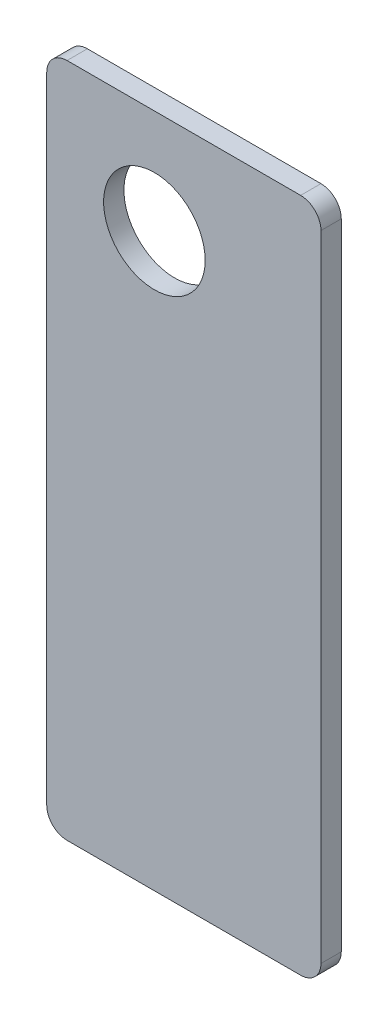
ISO-10303-21;
HEADER;
FILE_DESCRIPTION(('STEP AP214'),'2;1');
FILE_NAME('part.step','',(''),(''),'','','');
FILE_SCHEMA(('AUTOMOTIVE_DESIGN { 1 0 10303 214 1 1 1 1 }'));
ENDSEC;
DATA;
#1=APPLICATION_CONTEXT('core data for automotive mechanical design processes');
#2=APPLICATION_PROTOCOL_DEFINITION('international standard','automotive_design',2000,#1);
#3=PRODUCT_CONTEXT('',#1,'mechanical');
#4=PRODUCT('Part','Part','',(#3));
#5=PRODUCT_RELATED_PRODUCT_CATEGORY('part','',(#4));
#6=PRODUCT_DEFINITION_FORMATION('','',#4);
#7=PRODUCT_DEFINITION_CONTEXT('part definition',#1,'design');
#8=PRODUCT_DEFINITION('design','',#6,#7);
#9=PRODUCT_DEFINITION_SHAPE('','',#8);
#10=(LENGTH_UNIT() NAMED_UNIT(*) SI_UNIT(.MILLI.,.METRE.));
#11=(NAMED_UNIT(*) PLANE_ANGLE_UNIT() SI_UNIT($,.RADIAN.));
#12=(NAMED_UNIT(*) SI_UNIT($,.STERADIAN.) SOLID_ANGLE_UNIT());
#13=UNCERTAINTY_MEASURE_WITH_UNIT(LENGTH_MEASURE(1.E-05),#10,'distance_accuracy_value','');
#14=(GEOMETRIC_REPRESENTATION_CONTEXT(3) GLOBAL_UNCERTAINTY_ASSIGNED_CONTEXT((#13)) GLOBAL_UNIT_ASSIGNED_CONTEXT((#10,
#11,#12)) REPRESENTATION_CONTEXT('',''));
#15=CARTESIAN_POINT('',(0.,0.,0.));
#16=DIRECTION('',(0.,0.,1.));
#17=DIRECTION('',(1.,0.,0.));
#18=AXIS2_PLACEMENT_3D('',#15,#16,#17);
#19=CARTESIAN_POINT('',(11.5,38.5,10.));
#20=DIRECTION('',(0.,0.,1.));
#21=DIRECTION('',(1.,0.,0.));
#22=AXIS2_PLACEMENT_3D('',#19,#20,#21);
#23=PLANE('',#22);
#24=CARTESIAN_POINT('',(11.5,38.5,10.));
#25=DIRECTION('',(0.,0.,1.));
#26=DIRECTION('',(1.,0.,0.));
#27=AXIS2_PLACEMENT_3D('',#24,#25,#26);
#28=CIRCLE('',#27,2.);
#29=CARTESIAN_POINT('',(13.5,38.5,10.));
#30=VERTEX_POINT('',#29);
#31=CARTESIAN_POINT('',(11.5,40.5,10.));
#32=VERTEX_POINT('',#31);
#33=EDGE_CURVE('E167',#30,#32,#28,.T.);
#34=ORIENTED_EDGE('',*,*,#33,.T.);
#35=DIRECTION('',(-1.,0.,0.));
#36=VECTOR('',#35,1.);
#37=CARTESIAN_POINT('',(11.5,40.5,10.));
#38=LINE('',#37,#36);
#39=CARTESIAN_POINT('',(-11.5,40.5,10.));
#40=VERTEX_POINT('',#39);
#41=EDGE_CURVE('E103',#32,#40,#38,.T.);
#42=ORIENTED_EDGE('',*,*,#41,.T.);
#43=CARTESIAN_POINT('',(-11.5,38.5,10.));
#44=DIRECTION('',(0.,0.,1.));
#45=DIRECTION('',(1.,0.,0.));
#46=AXIS2_PLACEMENT_3D('',#43,#44,#45);
#47=CIRCLE('',#46,2.);
#48=CARTESIAN_POINT('',(-13.5,38.5,10.));
#49=VERTEX_POINT('',#48);
#50=EDGE_CURVE('E188',#40,#49,#47,.T.);
#51=ORIENTED_EDGE('',*,*,#50,.T.);
#52=DIRECTION('',(0.,-1.,0.));
#53=VECTOR('',#52,1.);
#54=CARTESIAN_POINT('',(-13.5,38.5,10.));
#55=LINE('',#54,#53);
#56=CARTESIAN_POINT('',(-13.5,-24.,10.));
#57=VERTEX_POINT('',#56);
#58=EDGE_CURVE('E202',#49,#57,#55,.T.);
#59=ORIENTED_EDGE('',*,*,#58,.T.);
#60=CARTESIAN_POINT('',(-11.5,-24.,10.));
#61=DIRECTION('',(0.,0.,1.));
#62=DIRECTION('',(1.,0.,0.));
#63=AXIS2_PLACEMENT_3D('',#60,#61,#62);
#64=CIRCLE('',#63,1.99999999999999);
#65=CARTESIAN_POINT('',(-11.5,-26.,10.));
#66=VERTEX_POINT('',#65);
#67=EDGE_CURVE('E122',#57,#66,#64,.T.);
#68=ORIENTED_EDGE('',*,*,#67,.T.);
#69=DIRECTION('',(1.,0.,0.));
#70=VECTOR('',#69,1.);
#71=CARTESIAN_POINT('',(-11.5,-26.,10.));
#72=LINE('',#71,#70);
#73=CARTESIAN_POINT('',(11.5,-26.,10.));
#74=VERTEX_POINT('',#73);
#75=EDGE_CURVE('E116',#66,#74,#72,.T.);
#76=ORIENTED_EDGE('',*,*,#75,.T.);
#77=CARTESIAN_POINT('',(11.5,-24.,10.));
#78=DIRECTION('',(0.,0.,1.));
#79=DIRECTION('',(1.,0.,0.));
#80=AXIS2_PLACEMENT_3D('',#77,#78,#79);
#81=CIRCLE('',#80,2.);
#82=CARTESIAN_POINT('',(13.5,-24.,10.));
#83=VERTEX_POINT('',#82);
#84=EDGE_CURVE('E120',#74,#83,#81,.T.);
#85=ORIENTED_EDGE('',*,*,#84,.T.);
#86=DIRECTION('',(0.,1.,0.));
#87=VECTOR('',#86,1.);
#88=CARTESIAN_POINT('',(13.5,-24.,10.));
#89=LINE('',#88,#87);
#90=EDGE_CURVE('E60',#83,#30,#89,.T.);
#91=ORIENTED_EDGE('',*,*,#90,.T.);
#92=EDGE_LOOP('',(#34,#42,#51,#59,#68,#76,#85,#91));
#93=FACE_BOUND('',#92,.T.);
#94=CARTESIAN_POINT('',(-2.9,30.25,10.));
#95=DIRECTION('',(0.,0.,1.));
#96=DIRECTION('',(1.,0.,0.));
#97=AXIS2_PLACEMENT_3D('',#94,#95,#96);
#98=CIRCLE('',#97,5.);
#99=CARTESIAN_POINT('',(2.1,30.25,10.));
#100=VERTEX_POINT('',#99);
#101=EDGE_CURVE('E148',#100,#100,#98,.T.);
#102=ORIENTED_EDGE('',*,*,#101,.F.);
#103=EDGE_LOOP('',(#102));
#104=FACE_BOUND('',#103,.T.);
#105=ADVANCED_FACE('F42',(#93,#104),#23,.T.);
#106=CARTESIAN_POINT('',(11.5,38.5,8.));
#107=DIRECTION('',(0.,0.,1.));
#108=DIRECTION('',(1.,0.,0.));
#109=AXIS2_PLACEMENT_3D('',#106,#107,#108);
#110=PLANE('',#109);
#111=CARTESIAN_POINT('',(11.5,38.5,8.));
#112=DIRECTION('',(0.,0.,1.));
#113=DIRECTION('',(1.,0.,0.));
#114=AXIS2_PLACEMENT_3D('',#111,#112,#113);
#115=CIRCLE('',#114,2.);
#116=CARTESIAN_POINT('',(13.5,38.5,8.));
#117=VERTEX_POINT('',#116);
#118=CARTESIAN_POINT('',(11.5,40.5,8.));
#119=VERTEX_POINT('',#118);
#120=EDGE_CURVE('E143',#117,#119,#115,.T.);
#121=ORIENTED_EDGE('',*,*,#120,.F.);
#122=DIRECTION('',(0.,1.,0.));
#123=VECTOR('',#122,1.);
#124=CARTESIAN_POINT('',(13.5,-24.,8.));
#125=LINE('',#124,#123);
#126=CARTESIAN_POINT('',(13.5,-24.,8.));
#127=VERTEX_POINT('',#126);
#128=EDGE_CURVE('E95',#127,#117,#125,.T.);
#129=ORIENTED_EDGE('',*,*,#128,.F.);
#130=CARTESIAN_POINT('',(11.5,-24.,8.));
#131=DIRECTION('',(0.,0.,1.));
#132=DIRECTION('',(1.,0.,0.));
#133=AXIS2_PLACEMENT_3D('',#130,#131,#132);
#134=CIRCLE('',#133,2.);
#135=CARTESIAN_POINT('',(11.5,-26.,8.));
#136=VERTEX_POINT('',#135);
#137=EDGE_CURVE('E89',#136,#127,#134,.T.);
#138=ORIENTED_EDGE('',*,*,#137,.F.);
#139=DIRECTION('',(1.,0.,0.));
#140=VECTOR('',#139,1.);
#141=CARTESIAN_POINT('',(5.25,-26.,8.));
#142=LINE('',#141,#140);
#143=CARTESIAN_POINT('',(-11.5,-26.,8.));
#144=VERTEX_POINT('',#143);
#145=EDGE_CURVE('E130',#144,#136,#142,.T.);
#146=ORIENTED_EDGE('',*,*,#145,.F.);
#147=CARTESIAN_POINT('',(-11.5,-24.,8.));
#148=DIRECTION('',(0.,0.,1.));
#149=DIRECTION('',(1.,0.,0.));
#150=AXIS2_PLACEMENT_3D('',#147,#148,#149);
#151=CIRCLE('',#150,1.99999999999999);
#152=CARTESIAN_POINT('',(-13.5,-24.,8.));
#153=VERTEX_POINT('',#152);
#154=EDGE_CURVE('E157',#153,#144,#151,.T.);
#155=ORIENTED_EDGE('',*,*,#154,.F.);
#156=DIRECTION('',(0.,-1.,0.));
#157=VECTOR('',#156,1.);
#158=CARTESIAN_POINT('',(-13.5,38.5,8.));
#159=LINE('',#158,#157);
#160=CARTESIAN_POINT('',(-13.5,38.5,8.));
#161=VERTEX_POINT('',#160);
#162=EDGE_CURVE('E154',#161,#153,#159,.T.);
#163=ORIENTED_EDGE('',*,*,#162,.F.);
#164=CARTESIAN_POINT('',(-11.5,38.5,8.));
#165=DIRECTION('',(0.,0.,1.));
#166=DIRECTION('',(1.,0.,0.));
#167=AXIS2_PLACEMENT_3D('',#164,#165,#166);
#168=CIRCLE('',#167,2.);
#169=CARTESIAN_POINT('',(-11.5,40.5,8.));
#170=VERTEX_POINT('',#169);
#171=EDGE_CURVE('E151',#170,#161,#168,.T.);
#172=ORIENTED_EDGE('',*,*,#171,.F.);
#173=DIRECTION('',(-1.,0.,0.));
#174=VECTOR('',#173,1.);
#175=CARTESIAN_POINT('',(11.5,40.5,8.));
#176=LINE('',#175,#174);
#177=EDGE_CURVE('E147',#119,#170,#176,.T.);
#178=ORIENTED_EDGE('',*,*,#177,.F.);
#179=EDGE_LOOP('',(#121,#129,#138,#146,#155,#163,#172,#178));
#180=FACE_BOUND('',#179,.T.);
#181=CARTESIAN_POINT('',(-2.9,30.25,8.));
#182=DIRECTION('',(0.,0.,1.));
#183=DIRECTION('',(1.,0.,0.));
#184=AXIS2_PLACEMENT_3D('',#181,#182,#183);
#185=CIRCLE('',#184,5.);
#186=CARTESIAN_POINT('',(2.1,30.25,8.));
#187=VERTEX_POINT('',#186);
#188=EDGE_CURVE('E212',#187,#187,#185,.T.);
#189=ORIENTED_EDGE('',*,*,#188,.T.);
#190=EDGE_LOOP('',(#189));
#191=FACE_BOUND('',#190,.T.);
#192=ADVANCED_FACE('F192',(#180,#191),#110,.F.);
#193=CARTESIAN_POINT('',(11.5,38.5,10.));
#194=DIRECTION('',(0.,0.,-1.));
#195=DIRECTION('',(-1.,0.,0.));
#196=AXIS2_PLACEMENT_3D('',#193,#194,#195);
#197=CYLINDRICAL_SURFACE('',#196,2.);
#198=ORIENTED_EDGE('',*,*,#120,.T.);
#199=DIRECTION('',(0.,0.,-1.));
#200=VECTOR('',#199,1.);
#201=CARTESIAN_POINT('',(11.5,40.5,10.));
#202=LINE('',#201,#200);
#203=EDGE_CURVE('E12',#32,#119,#202,.T.);
#204=ORIENTED_EDGE('',*,*,#203,.F.);
#205=ORIENTED_EDGE('',*,*,#33,.F.);
#206=DIRECTION('',(0.,0.,-1.));
#207=VECTOR('',#206,1.);
#208=CARTESIAN_POINT('',(13.5,38.5,10.));
#209=LINE('',#208,#207);
#210=EDGE_CURVE('E139',#30,#117,#209,.T.);
#211=ORIENTED_EDGE('',*,*,#210,.T.);
#212=EDGE_LOOP('',(#198,#204,#205,#211));
#213=FACE_BOUND('',#212,.T.);
#214=ADVANCED_FACE('F44',(#213),#197,.T.);
#215=CARTESIAN_POINT('',(11.5,40.5,10.));
#216=DIRECTION('',(0.,-1.,0.));
#217=DIRECTION('',(0.,0.,-1.));
#218=AXIS2_PLACEMENT_3D('',#215,#216,#217);
#219=PLANE('',#218);
#220=ORIENTED_EDGE('',*,*,#177,.T.);
#221=DIRECTION('',(0.,0.,-1.));
#222=VECTOR('',#221,1.);
#223=CARTESIAN_POINT('',(-11.5,40.5,10.));
#224=LINE('',#223,#222);
#225=EDGE_CURVE('E52',#40,#170,#224,.T.);
#226=ORIENTED_EDGE('',*,*,#225,.F.);
#227=ORIENTED_EDGE('',*,*,#41,.F.);
#228=ORIENTED_EDGE('',*,*,#203,.T.);
#229=EDGE_LOOP('',(#220,#226,#227,#228));
#230=FACE_BOUND('',#229,.T.);
#231=ADVANCED_FACE('F242',(#230),#219,.F.);
#232=CARTESIAN_POINT('',(-11.5,38.5,10.));
#233=DIRECTION('',(0.,0.,-1.));
#234=DIRECTION('',(-1.,0.,0.));
#235=AXIS2_PLACEMENT_3D('',#232,#233,#234);
#236=CYLINDRICAL_SURFACE('',#235,2.);
#237=ORIENTED_EDGE('',*,*,#171,.T.);
#238=DIRECTION('',(0.,0.,-1.));
#239=VECTOR('',#238,1.);
#240=CARTESIAN_POINT('',(-13.5,38.5,10.));
#241=LINE('',#240,#239);
#242=EDGE_CURVE('E178',#49,#161,#241,.T.);
#243=ORIENTED_EDGE('',*,*,#242,.F.);
#244=ORIENTED_EDGE('',*,*,#50,.F.);
#245=ORIENTED_EDGE('',*,*,#225,.T.);
#246=EDGE_LOOP('',(#237,#243,#244,#245));
#247=FACE_BOUND('',#246,.T.);
#248=ADVANCED_FACE('F186',(#247),#236,.T.);
#249=CARTESIAN_POINT('',(-13.5,38.5,10.));
#250=DIRECTION('',(1.,0.,0.));
#251=DIRECTION('',(0.,1.,0.));
#252=AXIS2_PLACEMENT_3D('',#249,#250,#251);
#253=PLANE('',#252);
#254=ORIENTED_EDGE('',*,*,#162,.T.);
#255=DIRECTION('',(0.,0.,-1.));
#256=VECTOR('',#255,1.);
#257=CARTESIAN_POINT('',(-13.5,-24.,10.));
#258=LINE('',#257,#256);
#259=EDGE_CURVE('E174',#57,#153,#258,.T.);
#260=ORIENTED_EDGE('',*,*,#259,.F.);
#261=ORIENTED_EDGE('',*,*,#58,.F.);
#262=ORIENTED_EDGE('',*,*,#242,.T.);
#263=EDGE_LOOP('',(#254,#260,#261,#262));
#264=FACE_BOUND('',#263,.T.);
#265=ADVANCED_FACE('F197',(#264),#253,.F.);
#266=CARTESIAN_POINT('',(-11.5,-24.,10.));
#267=DIRECTION('',(0.,0.,-1.));
#268=DIRECTION('',(-1.,0.,0.));
#269=AXIS2_PLACEMENT_3D('',#266,#267,#268);
#270=CYLINDRICAL_SURFACE('',#269,1.99999999999999);
#271=ORIENTED_EDGE('',*,*,#154,.T.);
#272=DIRECTION('',(0.,0.,-1.));
#273=VECTOR('',#272,1.);
#274=CARTESIAN_POINT('',(-11.5,-26.,10.));
#275=LINE('',#274,#273);
#276=EDGE_CURVE('E132',#66,#144,#275,.T.);
#277=ORIENTED_EDGE('',*,*,#276,.F.);
#278=ORIENTED_EDGE('',*,*,#67,.F.);
#279=ORIENTED_EDGE('',*,*,#259,.T.);
#280=EDGE_LOOP('',(#271,#277,#278,#279));
#281=FACE_BOUND('',#280,.T.);
#282=ADVANCED_FACE('F200',(#281),#270,.T.);
#283=CARTESIAN_POINT('',(5.25,-26.,10.));
#284=DIRECTION('',(0.,1.,0.));
#285=DIRECTION('',(0.,0.,1.));
#286=AXIS2_PLACEMENT_3D('',#283,#284,#285);
#287=PLANE('',#286);
#288=ORIENTED_EDGE('',*,*,#145,.T.);
#289=DIRECTION('',(0.,0.,-1.));
#290=VECTOR('',#289,1.);
#291=CARTESIAN_POINT('',(11.5,-26.,10.));
#292=LINE('',#291,#290);
#293=EDGE_CURVE('E128',#74,#136,#292,.T.);
#294=ORIENTED_EDGE('',*,*,#293,.F.);
#295=ORIENTED_EDGE('',*,*,#75,.F.);
#296=ORIENTED_EDGE('',*,*,#276,.T.);
#297=EDGE_LOOP('',(#288,#294,#295,#296));
#298=FACE_BOUND('',#297,.T.);
#299=ADVANCED_FACE('F129',(#298),#287,.F.);
#300=CARTESIAN_POINT('',(11.5,-24.,10.));
#301=DIRECTION('',(0.,0.,-1.));
#302=DIRECTION('',(-1.,0.,0.));
#303=AXIS2_PLACEMENT_3D('',#300,#301,#302);
#304=CYLINDRICAL_SURFACE('',#303,2.);
#305=ORIENTED_EDGE('',*,*,#137,.T.);
#306=DIRECTION('',(0.,0.,-1.));
#307=VECTOR('',#306,1.);
#308=CARTESIAN_POINT('',(13.5,-24.,10.));
#309=LINE('',#308,#307);
#310=EDGE_CURVE('E133',#83,#127,#309,.T.);
#311=ORIENTED_EDGE('',*,*,#310,.F.);
#312=ORIENTED_EDGE('',*,*,#84,.F.);
#313=ORIENTED_EDGE('',*,*,#293,.T.);
#314=EDGE_LOOP('',(#305,#311,#312,#313));
#315=FACE_BOUND('',#314,.T.);
#316=ADVANCED_FACE('F135',(#315),#304,.T.);
#317=CARTESIAN_POINT('',(13.5,-24.,10.));
#318=DIRECTION('',(-1.,0.,0.));
#319=DIRECTION('',(0.,-1.,0.));
#320=AXIS2_PLACEMENT_3D('',#317,#318,#319);
#321=PLANE('',#320);
#322=ORIENTED_EDGE('',*,*,#128,.T.);
#323=ORIENTED_EDGE('',*,*,#210,.F.);
#324=ORIENTED_EDGE('',*,*,#90,.F.);
#325=ORIENTED_EDGE('',*,*,#310,.T.);
#326=EDGE_LOOP('',(#322,#323,#324,#325));
#327=FACE_BOUND('',#326,.T.);
#328=ADVANCED_FACE('F230',(#327),#321,.F.);
#329=CARTESIAN_POINT('',(-2.9,30.25,10.));
#330=DIRECTION('',(0.,0.,-1.));
#331=DIRECTION('',(-1.,0.,0.));
#332=AXIS2_PLACEMENT_3D('',#329,#330,#331);
#333=CYLINDRICAL_SURFACE('',#332,5.);
#334=ORIENTED_EDGE('',*,*,#101,.T.);
#335=EDGE_LOOP('',(#334));
#336=FACE_BOUND('',#335,.T.);
#337=ORIENTED_EDGE('',*,*,#188,.F.);
#338=EDGE_LOOP('',(#337));
#339=FACE_BOUND('',#338,.T.);
#340=ADVANCED_FACE('F220',(#336,#339),#333,.F.);
#341=CLOSED_SHELL('',(#105,#192,#214,#231,#248,#265,#282,#299,#316,#328,#340));
#342=MANIFOLD_SOLID_BREP('B2',#341);
#343=ADVANCED_BREP_SHAPE_REPRESENTATION('',(#18,#342),#14);
#344=SHAPE_DEFINITION_REPRESENTATION(#9,#343);
ENDSEC;
END-ISO-10303-21;
